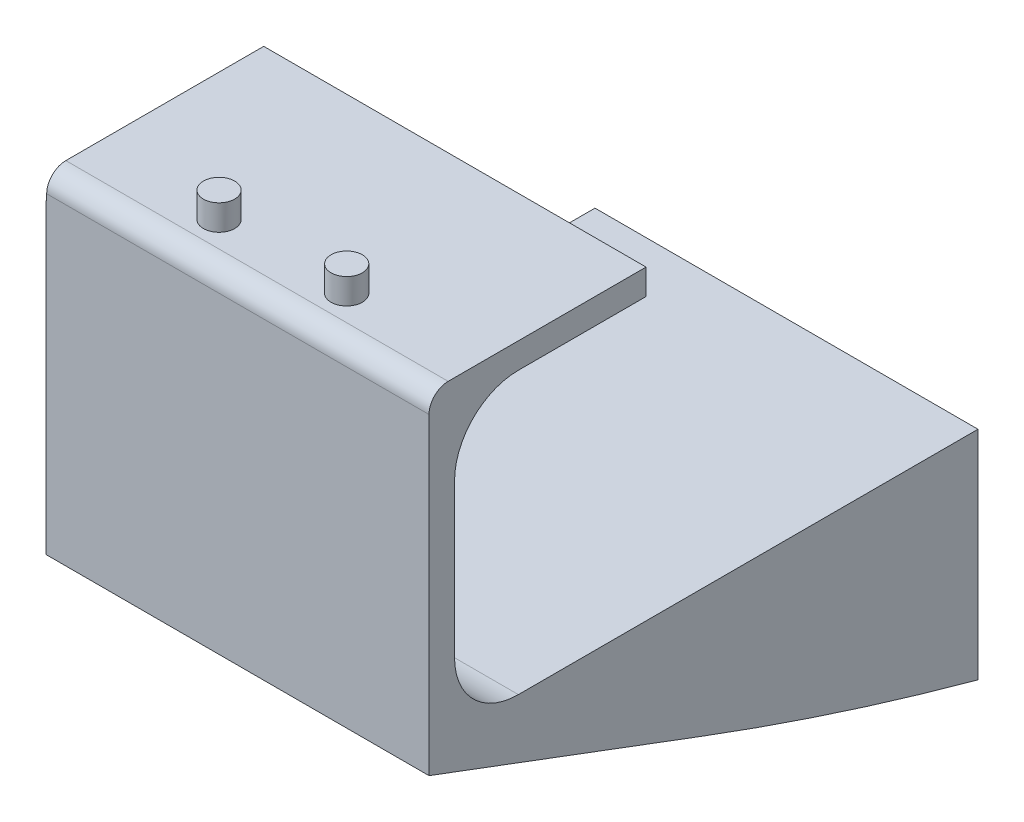
ISO-10303-21;
HEADER;
FILE_DESCRIPTION(('STEP AP214'),'2;1');
FILE_NAME('part.step','',(''),(''),'','','');
FILE_SCHEMA(('AUTOMOTIVE_DESIGN { 1 0 10303 214 1 1 1 1 }'));
ENDSEC;
DATA;
#1=APPLICATION_CONTEXT('core data for automotive mechanical design processes');
#2=APPLICATION_PROTOCOL_DEFINITION('international standard','automotive_design',2000,#1);
#3=PRODUCT_CONTEXT('',#1,'mechanical');
#4=PRODUCT('Part','Part','',(#3));
#5=PRODUCT_RELATED_PRODUCT_CATEGORY('part','',(#4));
#6=PRODUCT_DEFINITION_FORMATION('','',#4);
#7=PRODUCT_DEFINITION_CONTEXT('part definition',#1,'design');
#8=PRODUCT_DEFINITION('design','',#6,#7);
#9=PRODUCT_DEFINITION_SHAPE('','',#8);
#10=(LENGTH_UNIT() NAMED_UNIT(*) SI_UNIT(.MILLI.,.METRE.));
#11=(NAMED_UNIT(*) PLANE_ANGLE_UNIT() SI_UNIT($,.RADIAN.));
#12=(NAMED_UNIT(*) SI_UNIT($,.STERADIAN.) SOLID_ANGLE_UNIT());
#13=UNCERTAINTY_MEASURE_WITH_UNIT(LENGTH_MEASURE(1.E-05),#10,'distance_accuracy_value','');
#14=(GEOMETRIC_REPRESENTATION_CONTEXT(3) GLOBAL_UNCERTAINTY_ASSIGNED_CONTEXT((#13)) GLOBAL_UNIT_ASSIGNED_CONTEXT((#10,
#11,#12)) REPRESENTATION_CONTEXT('',''));
#15=CARTESIAN_POINT('',(0.,0.,0.));
#16=DIRECTION('',(0.,0.,1.));
#17=DIRECTION('',(1.,0.,0.));
#18=AXIS2_PLACEMENT_3D('',#15,#16,#17);
#19=CARTESIAN_POINT('',(0.,39.000001,-1.80570256664008E-13));
#20=DIRECTION('',(0.,-1.,0.));
#21=DIRECTION('',(0.,0.,-1.));
#22=AXIS2_PLACEMENT_3D('',#19,#20,#21);
#23=PLANE('',#22);
#24=DIRECTION('',(0.,0.,1.));
#25=VECTOR('',#24,1.);
#26=CARTESIAN_POINT('',(15.0530004892344,39.0000010000002,43.));
#27=LINE('',#26,#25);
#28=CARTESIAN_POINT('',(15.0530004892344,39.000001,41.));
#29=VERTEX_POINT('',#28);
#30=CARTESIAN_POINT('',(15.0530004892344,39.0000010000002,43.));
#31=VERTEX_POINT('',#30);
#32=EDGE_CURVE('E205',#29,#31,#27,.T.);
#33=ORIENTED_EDGE('',*,*,#32,.F.);
#34=DIRECTION('',(-1.,0.,0.));
#35=VECTOR('',#34,1.);
#36=CARTESIAN_POINT('',(45.000025,39.000001,41.));
#37=LINE('',#36,#35);
#38=CARTESIAN_POINT('',(15.,39.000001,41.));
#39=VERTEX_POINT('',#38);
#40=EDGE_CURVE('E221',#29,#39,#37,.T.);
#41=ORIENTED_EDGE('',*,*,#40,.T.);
#42=DIRECTION('',(0.,0.,-1.));
#43=VECTOR('',#42,1.);
#44=CARTESIAN_POINT('',(15.,39.000001,0.));
#45=LINE('',#44,#43);
#46=CARTESIAN_POINT('',(15.,39.000001,43.));
#47=VERTEX_POINT('',#46);
#48=EDGE_CURVE('E250',#47,#39,#45,.T.);
#49=ORIENTED_EDGE('',*,*,#48,.F.);
#50=DIRECTION('',(1.,0.,0.));
#51=VECTOR('',#50,1.);
#52=CARTESIAN_POINT('',(45.0000006705523,39.0000010000002,42.9999999999999));
#53=LINE('',#52,#51);
#54=EDGE_CURVE('E279',#47,#31,#53,.T.);
#55=ORIENTED_EDGE('',*,*,#54,.T.);
#56=EDGE_LOOP('',(#33,#41,#49,#55));
#57=FACE_BOUND('',#56,.T.);
#58=ADVANCED_FACE('F39',(#57),#23,.F.);
#59=CARTESIAN_POINT('',(0.,0.,43.));
#60=DIRECTION('',(0.,0.,-1.));
#61=DIRECTION('',(-1.,0.,0.));
#62=AXIS2_PLACEMENT_3D('',#59,#60,#61);
#63=PLANE('',#62);
#64=DIRECTION('',(0.,-1.,0.));
#65=VECTOR('',#64,1.);
#66=CARTESIAN_POINT('',(45.0000006705523,39.0000010000002,42.9999999999999));
#67=LINE('',#66,#65);
#68=CARTESIAN_POINT('',(45.0000006705523,39.5000010000002,42.9999999999999));
#69=VERTEX_POINT('',#68);
#70=CARTESIAN_POINT('',(45.,15.,43.));
#71=VERTEX_POINT('',#70);
#72=EDGE_CURVE('E288',#69,#71,#67,.T.);
#73=ORIENTED_EDGE('',*,*,#72,.F.);
#74=DIRECTION('',(1.,0.,0.));
#75=VECTOR('',#74,1.);
#76=CARTESIAN_POINT('',(0.,39.5000010000002,43.));
#77=LINE('',#76,#75);
#78=CARTESIAN_POINT('',(15.0530004892344,39.5000010000002,43.));
#79=VERTEX_POINT('',#78);
#80=EDGE_CURVE('E345',#69,#79,#77,.F.);
#81=ORIENTED_EDGE('',*,*,#80,.T.);
#82=DIRECTION('',(0.,-1.,0.));
#83=VECTOR('',#82,1.);
#84=CARTESIAN_POINT('',(15.0530004892344,41.0000010000002,43.));
#85=LINE('',#84,#83);
#86=EDGE_CURVE('E188',#79,#31,#85,.T.);
#87=ORIENTED_EDGE('',*,*,#86,.T.);
#88=ORIENTED_EDGE('',*,*,#54,.F.);
#89=DIRECTION('',(0.,1.,0.));
#90=VECTOR('',#89,1.);
#91=CARTESIAN_POINT('',(15.,39.000001,43.));
#92=LINE('',#91,#90);
#93=CARTESIAN_POINT('',(15.,15.,43.));
#94=VERTEX_POINT('',#93);
#95=EDGE_CURVE('E246',#94,#47,#92,.T.);
#96=ORIENTED_EDGE('',*,*,#95,.F.);
#97=DIRECTION('',(1.,0.,0.));
#98=VECTOR('',#97,1.);
#99=CARTESIAN_POINT('',(15.,15.,43.));
#100=LINE('',#99,#98);
#101=CARTESIAN_POINT('',(18.,15.,43.));
#102=VERTEX_POINT('',#101);
#103=EDGE_CURVE('E254',#94,#102,#100,.T.);
#104=ORIENTED_EDGE('',*,*,#103,.T.);
#105=DIRECTION('',(-1.,0.,0.));
#106=VECTOR('',#105,1.);
#107=CARTESIAN_POINT('',(42.0000006705523,15.0000000000002,43.));
#108=LINE('',#107,#106);
#109=CARTESIAN_POINT('',(42.0000006705523,15.0000000000002,43.));
#110=VERTEX_POINT('',#109);
#111=EDGE_CURVE('E284',#110,#102,#108,.T.);
#112=ORIENTED_EDGE('',*,*,#111,.F.);
#113=DIRECTION('',(-1.,0.,0.));
#114=VECTOR('',#113,1.);
#115=CARTESIAN_POINT('',(45.,15.,43.));
#116=LINE('',#115,#114);
#117=EDGE_CURVE('E311',#71,#110,#116,.T.);
#118=ORIENTED_EDGE('',*,*,#117,.F.);
#119=EDGE_LOOP('',(#73,#81,#87,#88,#96,#104,#112,#118));
#120=FACE_BOUND('',#119,.T.);
#121=ADVANCED_FACE('F398',(#120),#63,.F.);
#122=CARTESIAN_POINT('',(42.0000003352761,236.859239142874,-64.5596687774885));
#123=DIRECTION('',(-1.,0.,0.));
#124=DIRECTION('',(0.,0.,1.));
#125=AXIS2_PLACEMENT_3D('',#122,#123,#124);
#126=CYLINDRICAL_SURFACE('',#125,245.5);
#127=DIRECTION('',(-1.,0.,0.));
#128=VECTOR('',#127,1.);
#129=CARTESIAN_POINT('',(42.0000003352761,0.838178314235161,2.99999999999999));
#130=LINE('',#129,#128);
#131=CARTESIAN_POINT('',(42.0000006705523,0.838178314235161,3.));
#132=VERTEX_POINT('',#131);
#133=CARTESIAN_POINT('',(18.,0.8381783142348,3.));
#134=VERTEX_POINT('',#133);
#135=EDGE_CURVE('E316',#132,#134,#130,.T.);
#136=ORIENTED_EDGE('',*,*,#135,.T.);
#137=CARTESIAN_POINT('',(18.,236.859239142874,-64.5596687774885));
#138=DIRECTION('',(-1.,0.,0.));
#139=DIRECTION('',(0.,0.,-1.));
#140=AXIS2_PLACEMENT_3D('',#137,#138,#139);
#141=CIRCLE('',#140,245.5);
#142=CARTESIAN_POINT('',(18.,6.99042604967316,21.6411361324617));
#143=VERTEX_POINT('',#142);
#144=EDGE_CURVE('E235',#134,#143,#141,.T.);
#145=ORIENTED_EDGE('',*,*,#144,.T.);
#146=DIRECTION('',(1.,0.,0.));
#147=VECTOR('',#146,1.);
#148=CARTESIAN_POINT('',(15.,6.99042604967316,21.6411361324617));
#149=LINE('',#148,#147);
#150=CARTESIAN_POINT('',(15.,6.99042604967316,21.6411361324617));
#151=VERTEX_POINT('',#150);
#152=EDGE_CURVE('E263',#151,#143,#149,.T.);
#153=ORIENTED_EDGE('',*,*,#152,.F.);
#154=CARTESIAN_POINT('',(15.,236.859239142874,-64.5596687774885));
#155=DIRECTION('',(-1.,0.,0.));
#156=DIRECTION('',(0.,0.,-1.));
#157=AXIS2_PLACEMENT_3D('',#154,#155,#156);
#158=CIRCLE('',#157,245.5);
#159=CARTESIAN_POINT('',(15.,1.38777878078145E-13,0.));
#160=VERTEX_POINT('',#159);
#161=EDGE_CURVE('E239',#160,#151,#158,.T.);
#162=ORIENTED_EDGE('',*,*,#161,.F.);
#163=DIRECTION('',(-1.,0.,0.));
#164=VECTOR('',#163,1.);
#165=CARTESIAN_POINT('',(42.0000003352761,4.44089209850063E-13,0.));
#166=LINE('',#165,#164);
#167=CARTESIAN_POINT('',(45.,2.22044604925031E-13,0.));
#168=VERTEX_POINT('',#167);
#169=EDGE_CURVE('E312',#168,#160,#166,.T.);
#170=ORIENTED_EDGE('',*,*,#169,.F.);
#171=CARTESIAN_POINT('',(45.,236.859239142874,-64.5596687774885));
#172=DIRECTION('',(1.,0.,0.));
#173=DIRECTION('',(0.,0.,1.));
#174=AXIS2_PLACEMENT_3D('',#171,#172,#173);
#175=CIRCLE('',#174,245.5);
#176=CARTESIAN_POINT('',(45.,6.99042604967323,21.6411361324615));
#177=VERTEX_POINT('',#176);
#178=EDGE_CURVE('E295',#177,#168,#175,.T.);
#179=ORIENTED_EDGE('',*,*,#178,.F.);
#180=DIRECTION('',(-1.,0.,0.));
#181=VECTOR('',#180,1.);
#182=CARTESIAN_POINT('',(45.,6.99042604967323,21.6411361324615));
#183=LINE('',#182,#181);
#184=CARTESIAN_POINT('',(42.0000006705523,6.99042604967361,21.6411361324616));
#185=VERTEX_POINT('',#184);
#186=EDGE_CURVE('E304',#177,#185,#183,.T.);
#187=ORIENTED_EDGE('',*,*,#186,.T.);
#188=CARTESIAN_POINT('',(42.0000003352761,236.859239142874,-64.5596687774885));
#189=DIRECTION('',(1.,0.,0.));
#190=DIRECTION('',(0.,0.,1.));
#191=AXIS2_PLACEMENT_3D('',#188,#189,#190);
#192=CIRCLE('',#191,245.5);
#193=EDGE_CURVE('E296',#185,#132,#192,.T.);
#194=ORIENTED_EDGE('',*,*,#193,.T.);
#195=EDGE_LOOP('',(#136,#145,#153,#162,#170,#179,#187,#194));
#196=FACE_BOUND('',#195,.T.);
#197=ADVANCED_FACE('F404',(#196),#126,.T.);
#198=CARTESIAN_POINT('',(42.0000003352761,0.838178314235147,0.));
#199=DIRECTION('',(0.,0.,-1.));
#200=DIRECTION('',(0.,1.,0.));
#201=AXIS2_PLACEMENT_3D('',#198,#199,#200);
#202=PLANE('',#201);
#203=CARTESIAN_POINT('',(36.0000000447035,10.,0.));
#204=DIRECTION('',(0.,0.,1.));
#205=DIRECTION('',(1.,0.,0.));
#206=AXIS2_PLACEMENT_3D('',#203,#204,#205);
#207=CIRCLE('',#206,2.49999999999999);
#208=CARTESIAN_POINT('',(38.5000000447035,10.,0.));
#209=VERTEX_POINT('',#208);
#210=EDGE_CURVE('E456',#209,#209,#207,.T.);
#211=ORIENTED_EDGE('',*,*,#210,.T.);
#212=EDGE_LOOP('',(#211));
#213=FACE_BOUND('',#212,.T.);
#214=CARTESIAN_POINT('',(23.9999999552965,10.,0.));
#215=DIRECTION('',(0.,0.,1.));
#216=DIRECTION('',(1.,0.,0.));
#217=AXIS2_PLACEMENT_3D('',#214,#215,#216);
#218=CIRCLE('',#217,2.49999999999999);
#219=CARTESIAN_POINT('',(26.4999999552965,10.,0.));
#220=VERTEX_POINT('',#219);
#221=EDGE_CURVE('E204',#220,#220,#218,.T.);
#222=ORIENTED_EDGE('',*,*,#221,.T.);
#223=EDGE_LOOP('',(#222));
#224=FACE_BOUND('',#223,.T.);
#225=DIRECTION('',(-1.,0.,0.));
#226=VECTOR('',#225,1.);
#227=CARTESIAN_POINT('',(45.000025,17.,0.));
#228=LINE('',#227,#226);
#229=CARTESIAN_POINT('',(45.,17.,0.));
#230=VERTEX_POINT('',#229);
#231=CARTESIAN_POINT('',(15.,17.,0.));
#232=VERTEX_POINT('',#231);
#233=EDGE_CURVE('E220',#230,#232,#228,.T.);
#234=ORIENTED_EDGE('',*,*,#233,.F.);
#235=DIRECTION('',(0.,1.,0.));
#236=VECTOR('',#235,1.);
#237=CARTESIAN_POINT('',(45.,15.,0.));
#238=LINE('',#237,#236);
#239=EDGE_CURVE('E300',#168,#230,#238,.T.);
#240=ORIENTED_EDGE('',*,*,#239,.F.);
#241=ORIENTED_EDGE('',*,*,#169,.T.);
#242=DIRECTION('',(0.,-1.,0.));
#243=VECTOR('',#242,1.);
#244=CARTESIAN_POINT('',(15.,2.22044604925031E-13,0.));
#245=LINE('',#244,#243);
#246=EDGE_CURVE('E236',#232,#160,#245,.T.);
#247=ORIENTED_EDGE('',*,*,#246,.F.);
#248=EDGE_LOOP('',(#234,#240,#241,#247));
#249=FACE_BOUND('',#248,.T.);
#250=ADVANCED_FACE('F418',(#213,#224,#249),#202,.T.);
#251=CARTESIAN_POINT('',(45.,6.99042604967326,21.6411361324616));
#252=DIRECTION('',(0.,0.936329177569047,-0.351123441588386));
#253=DIRECTION('',(0.,0.351123441588386,0.936329177569047));
#254=AXIS2_PLACEMENT_3D('',#251,#252,#253);
#255=PLANE('',#254);
#256=DIRECTION('',(0.,-0.351123441588386,-0.936329177569047));
#257=VECTOR('',#256,1.);
#258=CARTESIAN_POINT('',(42.0000003352761,6.99042604967326,21.6411361324616));
#259=LINE('',#258,#257);
#260=EDGE_CURVE('E291',#110,#185,#259,.T.);
#261=ORIENTED_EDGE('',*,*,#260,.T.);
#262=ORIENTED_EDGE('',*,*,#186,.F.);
#263=DIRECTION('',(0.,-0.351123441588386,-0.936329177569047));
#264=VECTOR('',#263,1.);
#265=CARTESIAN_POINT('',(45.,6.99042604967326,21.6411361324616));
#266=LINE('',#265,#264);
#267=EDGE_CURVE('E292',#71,#177,#266,.T.);
#268=ORIENTED_EDGE('',*,*,#267,.F.);
#269=ORIENTED_EDGE('',*,*,#117,.T.);
#270=EDGE_LOOP('',(#261,#262,#268,#269));
#271=FACE_BOUND('',#270,.T.);
#272=ADVANCED_FACE('F415',(#271),#255,.F.);
#273=CARTESIAN_POINT('',(45.,236.859239142874,-64.5596687774885));
#274=DIRECTION('',(-1.,0.,0.));
#275=DIRECTION('',(0.,0.,1.));
#276=AXIS2_PLACEMENT_3D('',#273,#274,#275);
#277=PLANE('',#276);
#278=DIRECTION('',(0.,0.,-1.));
#279=VECTOR('',#278,1.);
#280=CARTESIAN_POINT('',(45.0000006705523,41.0000010000001,26.));
#281=LINE('',#280,#279);
#282=CARTESIAN_POINT('',(45.0000006705523,41.0000010000002,41.5));
#283=VERTEX_POINT('',#282);
#284=CARTESIAN_POINT('',(45.0000006705523,41.0000010000001,26.));
#285=VERTEX_POINT('',#284);
#286=EDGE_CURVE('E167',#283,#285,#281,.T.);
#287=ORIENTED_EDGE('',*,*,#286,.F.);
#288=CARTESIAN_POINT('',(45.,39.5000010000002,41.5));
#289=DIRECTION('',(-1.,0.,0.));
#290=DIRECTION('',(0.,0.,1.));
#291=AXIS2_PLACEMENT_3D('',#288,#289,#290);
#292=CIRCLE('',#291,1.5);
#293=EDGE_CURVE('E342',#283,#69,#292,.F.);
#294=ORIENTED_EDGE('',*,*,#293,.T.);
#295=ORIENTED_EDGE('',*,*,#72,.T.);
#296=ORIENTED_EDGE('',*,*,#267,.T.);
#297=ORIENTED_EDGE('',*,*,#178,.T.);
#298=ORIENTED_EDGE('',*,*,#239,.T.);
#299=DIRECTION('',(0.,0.,1.));
#300=VECTOR('',#299,1.);
#301=CARTESIAN_POINT('',(45.,17.,-64.5596687774885));
#302=LINE('',#301,#300);
#303=CARTESIAN_POINT('',(45.,17.,36.));
#304=VERTEX_POINT('',#303);
#305=EDGE_CURVE('E225',#230,#304,#302,.T.);
#306=ORIENTED_EDGE('',*,*,#305,.T.);
#307=CARTESIAN_POINT('',(45.,22.,36.));
#308=DIRECTION('',(-1.,0.,0.));
#309=DIRECTION('',(0.,0.,1.));
#310=AXIS2_PLACEMENT_3D('',#307,#308,#309);
#311=CIRCLE('',#310,5.);
#312=CARTESIAN_POINT('',(45.,22.,41.));
#313=VERTEX_POINT('',#312);
#314=EDGE_CURVE('E369',#304,#313,#311,.T.);
#315=ORIENTED_EDGE('',*,*,#314,.T.);
#316=DIRECTION('',(0.,1.,0.));
#317=VECTOR('',#316,1.);
#318=CARTESIAN_POINT('',(45.,236.859239142874,41.));
#319=LINE('',#318,#317);
#320=CARTESIAN_POINT('',(45.,34.0000010000002,41.));
#321=VERTEX_POINT('',#320);
#322=EDGE_CURVE('E231',#313,#321,#319,.T.);
#323=ORIENTED_EDGE('',*,*,#322,.T.);
#324=CARTESIAN_POINT('',(45.,34.0000010000002,36.));
#325=DIRECTION('',(-1.,0.,0.));
#326=DIRECTION('',(0.,0.,1.));
#327=AXIS2_PLACEMENT_3D('',#324,#325,#326);
#328=CIRCLE('',#327,5.);
#329=CARTESIAN_POINT('',(45.0000006705523,39.0000010000002,36.));
#330=VERTEX_POINT('',#329);
#331=EDGE_CURVE('E374',#321,#330,#328,.T.);
#332=ORIENTED_EDGE('',*,*,#331,.T.);
#333=DIRECTION('',(0.,0.,-1.));
#334=VECTOR('',#333,1.);
#335=CARTESIAN_POINT('',(45.0000006705523,39.0000010000001,26.));
#336=LINE('',#335,#334);
#337=CARTESIAN_POINT('',(45.0000006705523,39.0000010000001,26.));
#338=VERTEX_POINT('',#337);
#339=EDGE_CURVE('E184',#330,#338,#336,.T.);
#340=ORIENTED_EDGE('',*,*,#339,.T.);
#341=DIRECTION('',(0.,-1.,0.));
#342=VECTOR('',#341,1.);
#343=CARTESIAN_POINT('',(45.0000006705523,41.0000010000001,26.));
#344=LINE('',#343,#342);
#345=EDGE_CURVE('E181',#285,#338,#344,.T.);
#346=ORIENTED_EDGE('',*,*,#345,.F.);
#347=EDGE_LOOP('',(#287,#294,#295,#296,#297,#298,#306,#315,#323,#332,#340,#346));
#348=FACE_BOUND('',#347,.T.);
#349=ADVANCED_FACE('F182',(#348),#277,.F.);
#350=CARTESIAN_POINT('',(42.0000006705523,6.99042604967361,21.6411361324627));
#351=DIRECTION('',(1.,0.,0.));
#352=DIRECTION('',(0.,0.,-1.));
#353=AXIS2_PLACEMENT_3D('',#350,#351,#352);
#354=PLANE('',#353);
#355=ORIENTED_EDGE('',*,*,#193,.F.);
#356=ORIENTED_EDGE('',*,*,#260,.F.);
#357=DIRECTION('',(0.,0.,1.));
#358=VECTOR('',#357,1.);
#359=CARTESIAN_POINT('',(42.0000006705523,15.,2.99999999999996));
#360=LINE('',#359,#358);
#361=CARTESIAN_POINT('',(42.0000006705523,15.,2.99999999999996));
#362=VERTEX_POINT('',#361);
#363=EDGE_CURVE('E275',#362,#110,#360,.T.);
#364=ORIENTED_EDGE('',*,*,#363,.F.);
#365=DIRECTION('',(0.,-1.,0.));
#366=VECTOR('',#365,1.);
#367=CARTESIAN_POINT('',(42.0000006705523,6.99042604967352,2.99999999999997));
#368=LINE('',#367,#366);
#369=EDGE_CURVE('E276',#362,#132,#368,.T.);
#370=ORIENTED_EDGE('',*,*,#369,.T.);
#371=EDGE_LOOP('',(#355,#356,#364,#370));
#372=FACE_BOUND('',#371,.T.);
#373=ADVANCED_FACE('F414',(#372),#354,.F.);
#374=CARTESIAN_POINT('',(18.,6.99042604967352,2.99999999999997));
#375=DIRECTION('',(0.,0.,-1.));
#376=DIRECTION('',(0.,1.,0.));
#377=AXIS2_PLACEMENT_3D('',#374,#375,#376);
#378=PLANE('',#377);
#379=CARTESIAN_POINT('',(36.0000000447035,10.,3.));
#380=DIRECTION('',(0.,0.,1.));
#381=DIRECTION('',(1.,0.,0.));
#382=AXIS2_PLACEMENT_3D('',#379,#380,#381);
#383=CIRCLE('',#382,2.49999999999999);
#384=CARTESIAN_POINT('',(38.5000000447035,10.,3.));
#385=VERTEX_POINT('',#384);
#386=EDGE_CURVE('E460',#385,#385,#383,.T.);
#387=ORIENTED_EDGE('',*,*,#386,.F.);
#388=EDGE_LOOP('',(#387));
#389=FACE_BOUND('',#388,.T.);
#390=CARTESIAN_POINT('',(23.9999999552965,10.,3.));
#391=DIRECTION('',(0.,0.,1.));
#392=DIRECTION('',(1.,0.,0.));
#393=AXIS2_PLACEMENT_3D('',#390,#391,#392);
#394=CIRCLE('',#393,2.49999999999999);
#395=CARTESIAN_POINT('',(26.4999999552965,10.,3.));
#396=VERTEX_POINT('',#395);
#397=EDGE_CURVE('E452',#396,#396,#394,.T.);
#398=ORIENTED_EDGE('',*,*,#397,.F.);
#399=EDGE_LOOP('',(#398));
#400=FACE_BOUND('',#399,.T.);
#401=ORIENTED_EDGE('',*,*,#135,.F.);
#402=ORIENTED_EDGE('',*,*,#369,.F.);
#403=DIRECTION('',(1.,0.,0.));
#404=VECTOR('',#403,1.);
#405=CARTESIAN_POINT('',(18.,15.,2.99999999999996));
#406=LINE('',#405,#404);
#407=CARTESIAN_POINT('',(18.,15.,2.99999999999996));
#408=VERTEX_POINT('',#407);
#409=EDGE_CURVE('E271',#408,#362,#406,.T.);
#410=ORIENTED_EDGE('',*,*,#409,.F.);
#411=DIRECTION('',(0.,-1.,0.));
#412=VECTOR('',#411,1.);
#413=CARTESIAN_POINT('',(18.,6.99042604967352,2.99999999999997));
#414=LINE('',#413,#412);
#415=EDGE_CURVE('E280',#408,#134,#414,.T.);
#416=ORIENTED_EDGE('',*,*,#415,.T.);
#417=EDGE_LOOP('',(#401,#402,#410,#416));
#418=FACE_BOUND('',#417,.T.);
#419=ADVANCED_FACE('F409',(#389,#400,#418),#378,.F.);
#420=CARTESIAN_POINT('',(0.,15.,0.));
#421=DIRECTION('',(0.,-1.,0.));
#422=DIRECTION('',(0.,0.,-1.));
#423=AXIS2_PLACEMENT_3D('',#420,#421,#422);
#424=PLANE('',#423);
#425=DIRECTION('',(0.,0.,-1.));
#426=VECTOR('',#425,1.);
#427=CARTESIAN_POINT('',(18.,15.0000000000002,43.));
#428=LINE('',#427,#426);
#429=EDGE_CURVE('E267',#102,#408,#428,.T.);
#430=ORIENTED_EDGE('',*,*,#429,.T.);
#431=ORIENTED_EDGE('',*,*,#409,.T.);
#432=ORIENTED_EDGE('',*,*,#363,.T.);
#433=ORIENTED_EDGE('',*,*,#111,.T.);
#434=EDGE_LOOP('',(#430,#431,#432,#433));
#435=FACE_BOUND('',#434,.T.);
#436=ADVANCED_FACE('F503',(#435),#424,.T.);
#437=CARTESIAN_POINT('',(18.,236.859239142874,-64.5596687774885));
#438=DIRECTION('',(1.,0.,0.));
#439=DIRECTION('',(0.,0.,-1.));
#440=AXIS2_PLACEMENT_3D('',#437,#438,#439);
#441=PLANE('',#440);
#442=ORIENTED_EDGE('',*,*,#415,.F.);
#443=ORIENTED_EDGE('',*,*,#429,.F.);
#444=DIRECTION('',(0.,0.351123441588391,0.936329177569045));
#445=VECTOR('',#444,1.);
#446=CARTESIAN_POINT('',(18.,15.,43.));
#447=LINE('',#446,#445);
#448=EDGE_CURVE('E240',#143,#102,#447,.T.);
#449=ORIENTED_EDGE('',*,*,#448,.F.);
#450=ORIENTED_EDGE('',*,*,#144,.F.);
#451=EDGE_LOOP('',(#442,#443,#449,#450));
#452=FACE_BOUND('',#451,.T.);
#453=ADVANCED_FACE('F521',(#452),#441,.T.);
#454=CARTESIAN_POINT('',(15.,15.,43.));
#455=DIRECTION('',(0.,0.936329177569045,-0.35112344158839));
#456=DIRECTION('',(0.,0.351123441588391,0.936329177569045));
#457=AXIS2_PLACEMENT_3D('',#454,#455,#456);
#458=PLANE('',#457);
#459=ORIENTED_EDGE('',*,*,#448,.T.);
#460=ORIENTED_EDGE('',*,*,#103,.F.);
#461=DIRECTION('',(0.,0.351123441588391,0.936329177569045));
#462=VECTOR('',#461,1.);
#463=CARTESIAN_POINT('',(15.,15.,43.));
#464=LINE('',#463,#462);
#465=EDGE_CURVE('E243',#151,#94,#464,.T.);
#466=ORIENTED_EDGE('',*,*,#465,.F.);
#467=ORIENTED_EDGE('',*,*,#152,.T.);
#468=EDGE_LOOP('',(#459,#460,#466,#467));
#469=FACE_BOUND('',#468,.T.);
#470=ADVANCED_FACE('F523',(#469),#458,.F.);
#471=CARTESIAN_POINT('',(15.,236.859239142874,-64.5596687774885));
#472=DIRECTION('',(1.,0.,0.));
#473=DIRECTION('',(0.,0.,-1.));
#474=AXIS2_PLACEMENT_3D('',#471,#472,#473);
#475=PLANE('',#474);
#476=ORIENTED_EDGE('',*,*,#48,.T.);
#477=DIRECTION('',(0.,1.,0.));
#478=VECTOR('',#477,1.);
#479=CARTESIAN_POINT('',(15.,17.,41.));
#480=LINE('',#479,#478);
#481=CARTESIAN_POINT('',(15.,22.,41.));
#482=VERTEX_POINT('',#481);
#483=EDGE_CURVE('E217',#482,#39,#480,.T.);
#484=ORIENTED_EDGE('',*,*,#483,.F.);
#485=CARTESIAN_POINT('',(15.,22.,36.));
#486=DIRECTION('',(1.,0.,0.));
#487=DIRECTION('',(0.,0.,-1.));
#488=AXIS2_PLACEMENT_3D('',#485,#486,#487);
#489=CIRCLE('',#488,5.);
#490=CARTESIAN_POINT('',(15.,17.,36.));
#491=VERTEX_POINT('',#490);
#492=EDGE_CURVE('E366',#482,#491,#489,.T.);
#493=ORIENTED_EDGE('',*,*,#492,.T.);
#494=DIRECTION('',(0.,0.,1.));
#495=VECTOR('',#494,1.);
#496=CARTESIAN_POINT('',(15.,17.,0.));
#497=LINE('',#496,#495);
#498=EDGE_CURVE('E213',#232,#491,#497,.T.);
#499=ORIENTED_EDGE('',*,*,#498,.F.);
#500=ORIENTED_EDGE('',*,*,#246,.T.);
#501=ORIENTED_EDGE('',*,*,#161,.T.);
#502=ORIENTED_EDGE('',*,*,#465,.T.);
#503=ORIENTED_EDGE('',*,*,#95,.T.);
#504=EDGE_LOOP('',(#476,#484,#493,#499,#500,#501,#502,#503));
#505=FACE_BOUND('',#504,.T.);
#506=ADVANCED_FACE('F528',(#505),#475,.F.);
#507=CARTESIAN_POINT('',(45.000025,17.,41.));
#508=DIRECTION('',(0.,0.,1.));
#509=DIRECTION('',(1.,0.,0.));
#510=AXIS2_PLACEMENT_3D('',#507,#508,#509);
#511=PLANE('',#510);
#512=ORIENTED_EDGE('',*,*,#322,.F.);
#513=DIRECTION('',(-1.,0.,0.));
#514=VECTOR('',#513,1.);
#515=CARTESIAN_POINT('',(15.,22.,41.));
#516=LINE('',#515,#514);
#517=EDGE_CURVE('E356',#313,#482,#516,.T.);
#518=ORIENTED_EDGE('',*,*,#517,.T.);
#519=ORIENTED_EDGE('',*,*,#483,.T.);
#520=ORIENTED_EDGE('',*,*,#40,.F.);
#521=DIRECTION('',(0.,-1.,0.));
#522=VECTOR('',#521,1.);
#523=CARTESIAN_POINT('',(15.0530004892344,41.0000010000002,41.));
#524=LINE('',#523,#522);
#525=CARTESIAN_POINT('',(15.0530004892344,34.0000010000002,41.));
#526=VERTEX_POINT('',#525);
#527=EDGE_CURVE('E55',#29,#526,#524,.T.);
#528=ORIENTED_EDGE('',*,*,#527,.T.);
#529=DIRECTION('',(-1.,0.,0.));
#530=VECTOR('',#529,1.);
#531=CARTESIAN_POINT('',(45.000025,34.0000010000002,41.));
#532=LINE('',#531,#530);
#533=EDGE_CURVE('E351',#526,#321,#532,.F.);
#534=ORIENTED_EDGE('',*,*,#533,.T.);
#535=EDGE_LOOP('',(#512,#518,#519,#520,#528,#534));
#536=FACE_BOUND('',#535,.T.);
#537=ADVANCED_FACE('F442',(#536),#511,.F.);
#538=CARTESIAN_POINT('',(45.000025,17.,0.));
#539=DIRECTION('',(0.,-1.,0.));
#540=DIRECTION('',(0.,0.,-1.));
#541=AXIS2_PLACEMENT_3D('',#538,#539,#540);
#542=PLANE('',#541);
#543=ORIENTED_EDGE('',*,*,#498,.T.);
#544=DIRECTION('',(-1.,0.,0.));
#545=VECTOR('',#544,1.);
#546=CARTESIAN_POINT('',(45.,17.,36.));
#547=LINE('',#546,#545);
#548=EDGE_CURVE('E360',#491,#304,#547,.F.);
#549=ORIENTED_EDGE('',*,*,#548,.T.);
#550=ORIENTED_EDGE('',*,*,#305,.F.);
#551=ORIENTED_EDGE('',*,*,#233,.T.);
#552=EDGE_LOOP('',(#543,#549,#550,#551));
#553=FACE_BOUND('',#552,.T.);
#554=ADVANCED_FACE('F537',(#553),#542,.F.);
#555=CARTESIAN_POINT('',(15.0530004892344,41.0000010000002,43.));
#556=DIRECTION('',(1.,0.,0.));
#557=DIRECTION('',(0.,0.,-1.));
#558=AXIS2_PLACEMENT_3D('',#555,#556,#557);
#559=PLANE('',#558);
#560=ORIENTED_EDGE('',*,*,#86,.F.);
#561=CARTESIAN_POINT('',(15.0530004892344,39.5000010000002,41.5));
#562=DIRECTION('',(1.,0.,0.));
#563=DIRECTION('',(0.,0.,-1.));
#564=AXIS2_PLACEMENT_3D('',#561,#562,#563);
#565=CIRCLE('',#564,1.5);
#566=CARTESIAN_POINT('',(15.0530004892344,41.0000010000002,41.5));
#567=VERTEX_POINT('',#566);
#568=EDGE_CURVE('E348',#79,#567,#565,.F.);
#569=ORIENTED_EDGE('',*,*,#568,.T.);
#570=DIRECTION('',(0.,0.,1.));
#571=VECTOR('',#570,1.);
#572=CARTESIAN_POINT('',(15.0530004892344,41.0000010000002,43.));
#573=LINE('',#572,#571);
#574=CARTESIAN_POINT('',(15.0530004892344,41.0000010000001,26.));
#575=VERTEX_POINT('',#574);
#576=EDGE_CURVE('E178',#575,#567,#573,.T.);
#577=ORIENTED_EDGE('',*,*,#576,.F.);
#578=DIRECTION('',(0.,-1.,0.));
#579=VECTOR('',#578,1.);
#580=CARTESIAN_POINT('',(15.0530004892344,41.0000010000001,26.));
#581=LINE('',#580,#579);
#582=CARTESIAN_POINT('',(15.0530004892344,39.0000010000001,26.));
#583=VERTEX_POINT('',#582);
#584=EDGE_CURVE('E189',#575,#583,#581,.T.);
#585=ORIENTED_EDGE('',*,*,#584,.T.);
#586=CARTESIAN_POINT('',(15.0530004892344,39.0000010000002,36.));
#587=VERTEX_POINT('',#586);
#588=EDGE_CURVE('E200',#583,#587,#27,.T.);
#589=ORIENTED_EDGE('',*,*,#588,.T.);
#590=CARTESIAN_POINT('',(15.0530004892344,34.0000010000002,36.));
#591=DIRECTION('',(1.,0.,0.));
#592=DIRECTION('',(0.,0.,-1.));
#593=AXIS2_PLACEMENT_3D('',#590,#591,#592);
#594=CIRCLE('',#593,5.);
#595=EDGE_CURVE('E62',#587,#526,#594,.T.);
#596=ORIENTED_EDGE('',*,*,#595,.T.);
#597=ORIENTED_EDGE('',*,*,#527,.F.);
#598=ORIENTED_EDGE('',*,*,#32,.T.);
#599=EDGE_LOOP('',(#560,#569,#577,#585,#589,#596,#597,#598));
#600=FACE_BOUND('',#599,.T.);
#601=ADVANCED_FACE('F393',(#600),#559,.F.);
#602=CARTESIAN_POINT('',(15.0530004892344,41.0000010000001,26.));
#603=DIRECTION('',(0.,0.,1.));
#604=DIRECTION('',(0.,-1.,0.));
#605=AXIS2_PLACEMENT_3D('',#602,#603,#604);
#606=PLANE('',#605);
#607=DIRECTION('',(-1.,0.,0.));
#608=VECTOR('',#607,1.);
#609=CARTESIAN_POINT('',(15.0530004892344,39.0000010000001,26.));
#610=LINE('',#609,#608);
#611=EDGE_CURVE('E208',#338,#583,#610,.T.);
#612=ORIENTED_EDGE('',*,*,#611,.T.);
#613=ORIENTED_EDGE('',*,*,#584,.F.);
#614=DIRECTION('',(-1.,0.,0.));
#615=VECTOR('',#614,1.);
#616=CARTESIAN_POINT('',(15.0530004892344,41.0000010000001,26.));
#617=LINE('',#616,#615);
#618=EDGE_CURVE('E172',#285,#575,#617,.T.);
#619=ORIENTED_EDGE('',*,*,#618,.F.);
#620=ORIENTED_EDGE('',*,*,#345,.T.);
#621=EDGE_LOOP('',(#612,#613,#619,#620));
#622=FACE_BOUND('',#621,.T.);
#623=ADVANCED_FACE('F191',(#622),#606,.F.);
#624=CARTESIAN_POINT('',(0.,41.000001,-2.00302425846467E-13));
#625=DIRECTION('',(0.,-1.,0.));
#626=DIRECTION('',(0.,0.,-1.));
#627=AXIS2_PLACEMENT_3D('',#624,#625,#626);
#628=PLANE('',#627);
#629=CARTESIAN_POINT('',(35.0530004892344,41.0000010000002,39.5));
#630=DIRECTION('',(0.,-1.,0.));
#631=DIRECTION('',(0.,0.,-1.));
#632=AXIS2_PLACEMENT_3D('',#629,#630,#631);
#633=CIRCLE('',#632,1.225);
#634=CARTESIAN_POINT('',(35.0530004892344,41.0000010000002,38.275));
#635=VERTEX_POINT('',#634);
#636=EDGE_CURVE('E11',#635,#635,#633,.F.);
#637=ORIENTED_EDGE('',*,*,#636,.F.);
#638=EDGE_LOOP('',(#637));
#639=FACE_BOUND('',#638,.T.);
#640=CARTESIAN_POINT('',(25.0530004892344,41.0000010000002,39.5));
#641=DIRECTION('',(0.,-1.,0.));
#642=DIRECTION('',(0.,0.,-1.));
#643=AXIS2_PLACEMENT_3D('',#640,#641,#642);
#644=CIRCLE('',#643,1.22499999999999);
#645=CARTESIAN_POINT('',(25.0530004892344,41.0000010000002,38.275));
#646=VERTEX_POINT('',#645);
#647=EDGE_CURVE('E48',#646,#646,#644,.F.);
#648=ORIENTED_EDGE('',*,*,#647,.F.);
#649=EDGE_LOOP('',(#648));
#650=FACE_BOUND('',#649,.T.);
#651=ORIENTED_EDGE('',*,*,#576,.T.);
#652=DIRECTION('',(1.,0.,0.));
#653=VECTOR('',#652,1.);
#654=CARTESIAN_POINT('',(0.,41.0000010000002,41.5));
#655=LINE('',#654,#653);
#656=EDGE_CURVE('E175',#567,#283,#655,.T.);
#657=ORIENTED_EDGE('',*,*,#656,.T.);
#658=ORIENTED_EDGE('',*,*,#286,.T.);
#659=ORIENTED_EDGE('',*,*,#618,.T.);
#660=EDGE_LOOP('',(#651,#657,#658,#659));
#661=FACE_BOUND('',#660,.T.);
#662=ADVANCED_FACE('F170',(#639,#650,#661),#628,.F.);
#663=CARTESIAN_POINT('',(0.,39.000001,-1.91023672370312E-13));
#664=DIRECTION('',(0.,-1.,0.));
#665=DIRECTION('',(0.,0.,-1.));
#666=AXIS2_PLACEMENT_3D('',#663,#664,#665);
#667=PLANE('',#666);
#668=ORIENTED_EDGE('',*,*,#339,.F.);
#669=DIRECTION('',(-1.,0.,0.));
#670=VECTOR('',#669,1.);
#671=CARTESIAN_POINT('',(0.,39.0000010000002,36.));
#672=LINE('',#671,#670);
#673=EDGE_CURVE('E363',#330,#587,#672,.T.);
#674=ORIENTED_EDGE('',*,*,#673,.T.);
#675=ORIENTED_EDGE('',*,*,#588,.F.);
#676=ORIENTED_EDGE('',*,*,#611,.F.);
#677=EDGE_LOOP('',(#668,#674,#675,#676));
#678=FACE_BOUND('',#677,.T.);
#679=ADVANCED_FACE('F383',(#678),#667,.T.);
#680=CARTESIAN_POINT('',(23.9999999552965,10.,3.));
#681=DIRECTION('',(0.,0.,1.));
#682=DIRECTION('',(1.,0.,0.));
#683=AXIS2_PLACEMENT_3D('',#680,#681,#682);
#684=CYLINDRICAL_SURFACE('',#683,2.49999999999999);
#685=ORIENTED_EDGE('',*,*,#221,.F.);
#686=EDGE_LOOP('',(#685));
#687=FACE_BOUND('',#686,.T.);
#688=ORIENTED_EDGE('',*,*,#397,.T.);
#689=EDGE_LOOP('',(#688));
#690=FACE_BOUND('',#689,.T.);
#691=ADVANCED_FACE('F390',(#687,#690),#684,.F.);
#692=CARTESIAN_POINT('',(36.0000000447035,10.,3.));
#693=DIRECTION('',(0.,0.,1.));
#694=DIRECTION('',(1.,0.,0.));
#695=AXIS2_PLACEMENT_3D('',#692,#693,#694);
#696=CYLINDRICAL_SURFACE('',#695,2.49999999999999);
#697=ORIENTED_EDGE('',*,*,#210,.F.);
#698=EDGE_LOOP('',(#697));
#699=FACE_BOUND('',#698,.T.);
#700=ORIENTED_EDGE('',*,*,#386,.T.);
#701=EDGE_LOOP('',(#700));
#702=FACE_BOUND('',#701,.T.);
#703=ADVANCED_FACE('F429',(#699,#702),#696,.F.);
#704=CARTESIAN_POINT('',(0.,39.5000010000002,41.5));
#705=DIRECTION('',(1.,0.,0.));
#706=DIRECTION('',(0.,0.,-1.));
#707=AXIS2_PLACEMENT_3D('',#704,#705,#706);
#708=CYLINDRICAL_SURFACE('',#707,1.5);
#709=ORIENTED_EDGE('',*,*,#568,.F.);
#710=ORIENTED_EDGE('',*,*,#80,.F.);
#711=ORIENTED_EDGE('',*,*,#293,.F.);
#712=ORIENTED_EDGE('',*,*,#656,.F.);
#713=EDGE_LOOP('',(#709,#710,#711,#712));
#714=FACE_BOUND('',#713,.T.);
#715=ADVANCED_FACE('F426',(#714),#708,.T.);
#716=CARTESIAN_POINT('',(45.000025,22.,36.));
#717=DIRECTION('',(1.,0.,0.));
#718=DIRECTION('',(0.,0.,-1.));
#719=AXIS2_PLACEMENT_3D('',#716,#717,#718);
#720=CYLINDRICAL_SURFACE('',#719,5.);
#721=ORIENTED_EDGE('',*,*,#314,.F.);
#722=ORIENTED_EDGE('',*,*,#548,.F.);
#723=ORIENTED_EDGE('',*,*,#492,.F.);
#724=ORIENTED_EDGE('',*,*,#517,.F.);
#725=EDGE_LOOP('',(#721,#722,#723,#724));
#726=FACE_BOUND('',#725,.T.);
#727=ADVANCED_FACE('F428',(#726),#720,.F.);
#728=CARTESIAN_POINT('',(0.,34.0000010000002,36.));
#729=DIRECTION('',(-1.,0.,0.));
#730=DIRECTION('',(0.,0.,1.));
#731=AXIS2_PLACEMENT_3D('',#728,#729,#730);
#732=CYLINDRICAL_SURFACE('',#731,5.);
#733=ORIENTED_EDGE('',*,*,#331,.F.);
#734=ORIENTED_EDGE('',*,*,#533,.F.);
#735=ORIENTED_EDGE('',*,*,#595,.F.);
#736=ORIENTED_EDGE('',*,*,#673,.F.);
#737=EDGE_LOOP('',(#733,#734,#735,#736));
#738=FACE_BOUND('',#737,.T.);
#739=ADVANCED_FACE('F41',(#738),#732,.F.);
#740=CARTESIAN_POINT('',(25.0530004892344,43.0000010000002,39.5));
#741=DIRECTION('',(0.,-1.,0.));
#742=DIRECTION('',(0.,0.,-1.));
#743=AXIS2_PLACEMENT_3D('',#740,#741,#742);
#744=CYLINDRICAL_SURFACE('',#743,1.22499999999999);
#745=CARTESIAN_POINT('',(25.0530004892344,43.0000010000002,39.5));
#746=DIRECTION('',(0.,1.,0.));
#747=DIRECTION('',(0.,0.,1.));
#748=AXIS2_PLACEMENT_3D('',#745,#746,#747);
#749=CIRCLE('',#748,1.22499999999999);
#750=CARTESIAN_POINT('',(25.0530004892344,43.0000010000002,40.725));
#751=VERTEX_POINT('',#750);
#752=EDGE_CURVE('E464',#751,#751,#749,.T.);
#753=ORIENTED_EDGE('',*,*,#752,.F.);
#754=EDGE_LOOP('',(#753));
#755=FACE_BOUND('',#754,.T.);
#756=ORIENTED_EDGE('',*,*,#647,.T.);
#757=EDGE_LOOP('',(#756));
#758=FACE_BOUND('',#757,.T.);
#759=ADVANCED_FACE('F380',(#755,#758),#744,.T.);
#760=CARTESIAN_POINT('',(25.0530004892344,43.0000010000002,39.5));
#761=DIRECTION('',(0.,1.,0.));
#762=DIRECTION('',(0.,0.,1.));
#763=AXIS2_PLACEMENT_3D('',#760,#761,#762);
#764=PLANE('',#763);
#765=ORIENTED_EDGE('',*,*,#752,.T.);
#766=EDGE_LOOP('',(#765));
#767=FACE_BOUND('',#766,.T.);
#768=ADVANCED_FACE('F478',(#767),#764,.T.);
#769=CARTESIAN_POINT('',(35.0530004892344,43.0000010000002,39.5));
#770=DIRECTION('',(0.,-1.,0.));
#771=DIRECTION('',(0.,0.,-1.));
#772=AXIS2_PLACEMENT_3D('',#769,#770,#771);
#773=CYLINDRICAL_SURFACE('',#772,1.225);
#774=CARTESIAN_POINT('',(35.0530004892344,43.0000010000002,39.5));
#775=DIRECTION('',(0.,1.,0.));
#776=DIRECTION('',(0.,0.,1.));
#777=AXIS2_PLACEMENT_3D('',#774,#775,#776);
#778=CIRCLE('',#777,1.225);
#779=CARTESIAN_POINT('',(35.0530004892344,43.0000010000002,40.725));
#780=VERTEX_POINT('',#779);
#781=EDGE_CURVE('E468',#780,#780,#778,.T.);
#782=ORIENTED_EDGE('',*,*,#781,.F.);
#783=EDGE_LOOP('',(#782));
#784=FACE_BOUND('',#783,.T.);
#785=ORIENTED_EDGE('',*,*,#636,.T.);
#786=EDGE_LOOP('',(#785));
#787=FACE_BOUND('',#786,.T.);
#788=ADVANCED_FACE('F475',(#784,#787),#773,.T.);
#789=CARTESIAN_POINT('',(35.0530004892344,43.0000010000002,39.5));
#790=DIRECTION('',(0.,1.,0.));
#791=DIRECTION('',(0.,0.,1.));
#792=AXIS2_PLACEMENT_3D('',#789,#790,#791);
#793=PLANE('',#792);
#794=ORIENTED_EDGE('',*,*,#781,.T.);
#795=EDGE_LOOP('',(#794));
#796=FACE_BOUND('',#795,.T.);
#797=ADVANCED_FACE('F473',(#796),#793,.T.);
#798=CLOSED_SHELL('',(#58,#121,#197,#250,#272,#349,#373,#419,#436,#453,#470,#506,#537,#554,#601,
#623,#662,#679,#691,#703,#715,#727,#739,#759,#768,#788,#797));
#799=MANIFOLD_SOLID_BREP('B2',#798);
#800=ADVANCED_BREP_SHAPE_REPRESENTATION('',(#18,#799),#14);
#801=SHAPE_DEFINITION_REPRESENTATION(#9,#800);
ENDSEC;
END-ISO-10303-21;
